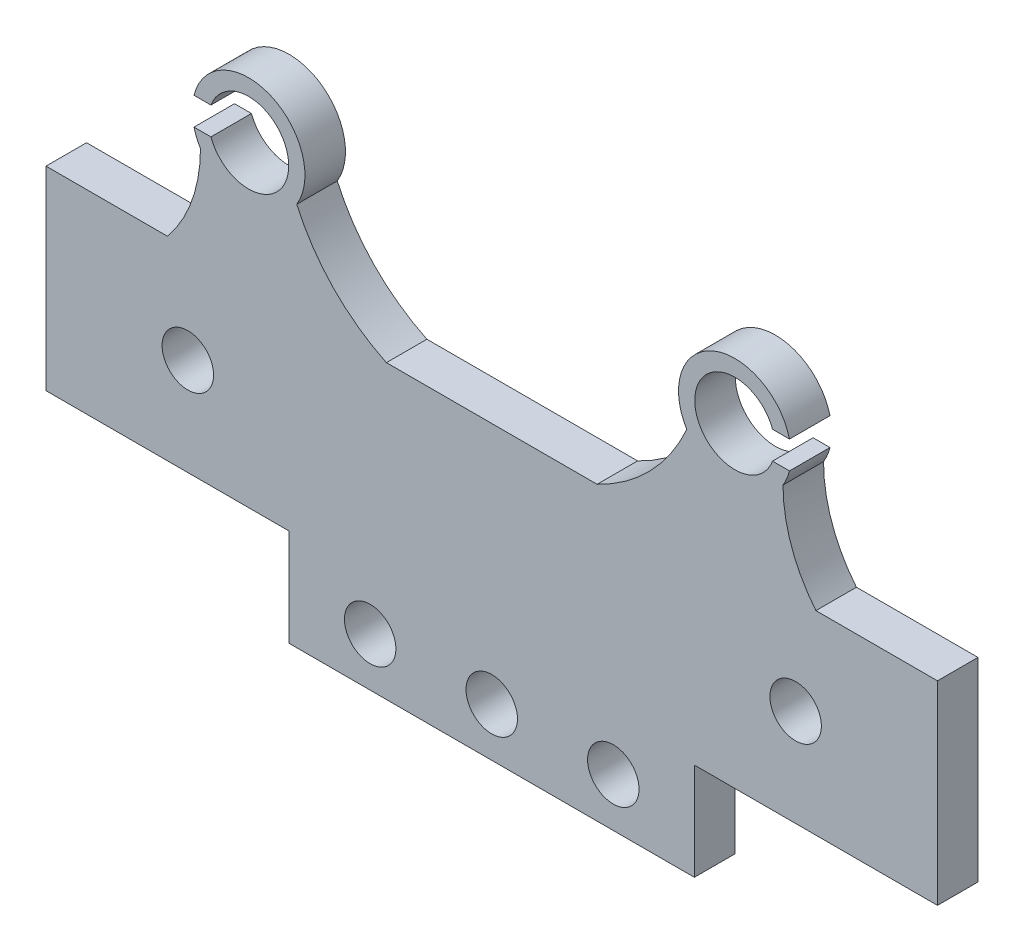
ISO-10303-21;
HEADER;
FILE_DESCRIPTION(('STEP AP214'),'2;1');
FILE_NAME('part.step','',(''),(''),'','','');
FILE_SCHEMA(('AUTOMOTIVE_DESIGN { 1 0 10303 214 1 1 1 1 }'));
ENDSEC;
DATA;
#1=APPLICATION_CONTEXT('core data for automotive mechanical design processes');
#2=APPLICATION_PROTOCOL_DEFINITION('international standard','automotive_design',2000,#1);
#3=PRODUCT_CONTEXT('',#1,'mechanical');
#4=PRODUCT('Part','Part','',(#3));
#5=PRODUCT_RELATED_PRODUCT_CATEGORY('part','',(#4));
#6=PRODUCT_DEFINITION_FORMATION('','',#4);
#7=PRODUCT_DEFINITION_CONTEXT('part definition',#1,'design');
#8=PRODUCT_DEFINITION('design','',#6,#7);
#9=PRODUCT_DEFINITION_SHAPE('','',#8);
#10=(LENGTH_UNIT() NAMED_UNIT(*) SI_UNIT(.MILLI.,.METRE.));
#11=(NAMED_UNIT(*) PLANE_ANGLE_UNIT() SI_UNIT($,.RADIAN.));
#12=(NAMED_UNIT(*) SI_UNIT($,.STERADIAN.) SOLID_ANGLE_UNIT());
#13=UNCERTAINTY_MEASURE_WITH_UNIT(LENGTH_MEASURE(1.E-05),#10,'distance_accuracy_value','');
#14=(GEOMETRIC_REPRESENTATION_CONTEXT(3) GLOBAL_UNCERTAINTY_ASSIGNED_CONTEXT((#13)) GLOBAL_UNIT_ASSIGNED_CONTEXT((#10,
#11,#12)) REPRESENTATION_CONTEXT('',''));
#15=CARTESIAN_POINT('',(0.,0.,0.));
#16=DIRECTION('',(0.,0.,1.));
#17=DIRECTION('',(1.,0.,0.));
#18=AXIS2_PLACEMENT_3D('',#15,#16,#17);
#19=CARTESIAN_POINT('',(53.9385104929325,11.3893777371026,5.));
#20=DIRECTION('',(0.,0.,1.));
#21=DIRECTION('',(1.,0.,0.));
#22=AXIS2_PLACEMENT_3D('',#19,#20,#21);
#23=PLANE('',#22);
#24=CARTESIAN_POINT('',(37.5,-12.,5.));
#25=DIRECTION('',(0.,0.,1.));
#26=DIRECTION('',(-1.,0.,0.));
#27=AXIS2_PLACEMENT_3D('',#24,#25,#26);
#28=CIRCLE('',#27,3.175);
#29=CARTESIAN_POINT('',(34.325,-12.,5.));
#30=VERTEX_POINT('',#29);
#31=EDGE_CURVE('E347',#30,#30,#28,.T.);
#32=ORIENTED_EDGE('',*,*,#31,.F.);
#33=EDGE_LOOP('',(#32));
#34=FACE_BOUND('',#33,.T.);
#35=CARTESIAN_POINT('',(-15.,-30.,5.));
#36=DIRECTION('',(0.,0.,1.));
#37=DIRECTION('',(1.,0.,0.));
#38=AXIS2_PLACEMENT_3D('',#35,#36,#37);
#39=CIRCLE('',#38,3.175);
#40=CARTESIAN_POINT('',(-11.825,-30.,5.));
#41=VERTEX_POINT('',#40);
#42=EDGE_CURVE('E331',#41,#41,#39,.T.);
#43=ORIENTED_EDGE('',*,*,#42,.F.);
#44=EDGE_LOOP('',(#43));
#45=FACE_BOUND('',#44,.T.);
#46=CARTESIAN_POINT('',(-37.5,-12.,5.));
#47=DIRECTION('',(0.,0.,1.));
#48=DIRECTION('',(1.,0.,0.));
#49=AXIS2_PLACEMENT_3D('',#46,#47,#48);
#50=CIRCLE('',#49,3.175);
#51=CARTESIAN_POINT('',(-34.325,-12.,5.));
#52=VERTEX_POINT('',#51);
#53=EDGE_CURVE('E317',#52,#52,#50,.T.);
#54=ORIENTED_EDGE('',*,*,#53,.F.);
#55=EDGE_LOOP('',(#54));
#56=FACE_BOUND('',#55,.T.);
#57=CARTESIAN_POINT('',(0.,-30.,5.));
#58=DIRECTION('',(0.,0.,1.));
#59=DIRECTION('',(1.,0.,0.));
#60=AXIS2_PLACEMENT_3D('',#57,#58,#59);
#61=CIRCLE('',#60,3.175);
#62=CARTESIAN_POINT('',(3.175,-30.,5.));
#63=VERTEX_POINT('',#62);
#64=EDGE_CURVE('E323',#63,#63,#61,.T.);
#65=ORIENTED_EDGE('',*,*,#64,.F.);
#66=EDGE_LOOP('',(#65));
#67=FACE_BOUND('',#66,.T.);
#68=CARTESIAN_POINT('',(15.,-30.,5.));
#69=DIRECTION('',(0.,0.,1.));
#70=DIRECTION('',(-1.,0.,0.));
#71=AXIS2_PLACEMENT_3D('',#68,#69,#70);
#72=CIRCLE('',#71,3.175);
#73=CARTESIAN_POINT('',(11.825,-30.,5.));
#74=VERTEX_POINT('',#73);
#75=EDGE_CURVE('E355',#74,#74,#72,.T.);
#76=ORIENTED_EDGE('',*,*,#75,.F.);
#77=EDGE_LOOP('',(#76));
#78=FACE_BOUND('',#77,.T.);
#79=CARTESIAN_POINT('',(-30.,15.,5.));
#80=DIRECTION('',(0.,0.,1.));
#81=DIRECTION('',(1.,0.,0.));
#82=AXIS2_PLACEMENT_3D('',#79,#80,#81);
#83=CIRCLE('',#82,6.95);
#84=CARTESIAN_POINT('',(-24.0614895070675,11.3893777371027,5.));
#85=VERTEX_POINT('',#84);
#86=CARTESIAN_POINT('',(-36.738879728857,16.7,5.));
#87=VERTEX_POINT('',#86);
#88=EDGE_CURVE('E221',#85,#87,#83,.T.);
#89=ORIENTED_EDGE('',*,*,#88,.T.);
#90=DIRECTION('',(-1.,0.,0.));
#91=VECTOR('',#90,1.);
#92=CARTESIAN_POINT('',(-30.,16.7,5.));
#93=LINE('',#92,#91);
#94=CARTESIAN_POINT('',(-34.6489246068311,16.7,5.));
#95=VERTEX_POINT('',#94);
#96=EDGE_CURVE('E205',#95,#87,#93,.T.);
#97=ORIENTED_EDGE('',*,*,#96,.F.);
#98=CARTESIAN_POINT('',(-30.,15.,5.));
#99=DIRECTION('',(0.,0.,1.));
#100=DIRECTION('',(1.,0.,0.));
#101=AXIS2_PLACEMENT_3D('',#98,#99,#100);
#102=CIRCLE('',#101,4.95);
#103=CARTESIAN_POINT('',(-34.6489246068311,13.3,5.));
#104=VERTEX_POINT('',#103);
#105=EDGE_CURVE('E306',#104,#95,#102,.T.);
#106=ORIENTED_EDGE('',*,*,#105,.F.);
#107=DIRECTION('',(1.,0.,0.));
#108=VECTOR('',#107,1.);
#109=CARTESIAN_POINT('',(-30.,13.3,5.));
#110=LINE('',#109,#108);
#111=CARTESIAN_POINT('',(-36.738879728857,13.3,5.));
#112=VERTEX_POINT('',#111);
#113=EDGE_CURVE('E69',#112,#104,#110,.T.);
#114=ORIENTED_EDGE('',*,*,#113,.F.);
#115=CARTESIAN_POINT('',(-35.9385104929326,11.3893777371026,5.));
#116=VERTEX_POINT('',#115);
#117=EDGE_CURVE('E233',#112,#116,#83,.T.);
#118=ORIENTED_EDGE('',*,*,#117,.T.);
#119=CARTESIAN_POINT('',(-53.9385104929325,11.3893777371026,5.));
#120=DIRECTION('',(0.,0.,-1.));
#121=DIRECTION('',(-1.,0.,0.));
#122=AXIS2_PLACEMENT_3D('',#119,#120,#121);
#123=CIRCLE('',#122,18.);
#124=CARTESIAN_POINT('',(-40.,0.,5.));
#125=VERTEX_POINT('',#124);
#126=EDGE_CURVE('E232',#116,#125,#123,.T.);
#127=ORIENTED_EDGE('',*,*,#126,.T.);
#128=DIRECTION('',(-1.,0.,0.));
#129=VECTOR('',#128,1.);
#130=CARTESIAN_POINT('',(-40.,0.,5.));
#131=LINE('',#130,#129);
#132=CARTESIAN_POINT('',(-55.,0.,5.));
#133=VERTEX_POINT('',#132);
#134=EDGE_CURVE('E255',#125,#133,#131,.T.);
#135=ORIENTED_EDGE('',*,*,#134,.T.);
#136=DIRECTION('',(0.,-1.,0.));
#137=VECTOR('',#136,1.);
#138=CARTESIAN_POINT('',(-55.,0.,5.));
#139=LINE('',#138,#137);
#140=CARTESIAN_POINT('',(-55.,-24.,5.));
#141=VERTEX_POINT('',#140);
#142=EDGE_CURVE('E261',#133,#141,#139,.T.);
#143=ORIENTED_EDGE('',*,*,#142,.T.);
#144=DIRECTION('',(1.,0.,0.));
#145=VECTOR('',#144,1.);
#146=CARTESIAN_POINT('',(-55.,-24.,5.));
#147=LINE('',#146,#145);
#148=CARTESIAN_POINT('',(-25.,-24.,5.));
#149=VERTEX_POINT('',#148);
#150=EDGE_CURVE('E267',#141,#149,#147,.T.);
#151=ORIENTED_EDGE('',*,*,#150,.T.);
#152=DIRECTION('',(0.,-1.,0.));
#153=VECTOR('',#152,1.);
#154=CARTESIAN_POINT('',(-25.,-24.,5.));
#155=LINE('',#154,#153);
#156=CARTESIAN_POINT('',(-25.,-36.,5.));
#157=VERTEX_POINT('',#156);
#158=EDGE_CURVE('E271',#149,#157,#155,.T.);
#159=ORIENTED_EDGE('',*,*,#158,.T.);
#160=DIRECTION('',(1.,0.,0.));
#161=VECTOR('',#160,1.);
#162=CARTESIAN_POINT('',(-25.,-36.,5.));
#163=LINE('',#162,#161);
#164=CARTESIAN_POINT('',(25.,-36.,5.));
#165=VERTEX_POINT('',#164);
#166=EDGE_CURVE('E436',#157,#165,#163,.T.);
#167=ORIENTED_EDGE('',*,*,#166,.T.);
#168=DIRECTION('',(0.,1.,0.));
#169=VECTOR('',#168,1.);
#170=CARTESIAN_POINT('',(25.,-24.,5.));
#171=LINE('',#170,#169);
#172=CARTESIAN_POINT('',(25.,-24.,5.));
#173=VERTEX_POINT('',#172);
#174=EDGE_CURVE('E440',#165,#173,#171,.T.);
#175=ORIENTED_EDGE('',*,*,#174,.T.);
#176=DIRECTION('',(1.,0.,0.));
#177=VECTOR('',#176,1.);
#178=CARTESIAN_POINT('',(55.,-24.,5.));
#179=LINE('',#178,#177);
#180=CARTESIAN_POINT('',(55.,-24.,5.));
#181=VERTEX_POINT('',#180);
#182=EDGE_CURVE('E444',#173,#181,#179,.T.);
#183=ORIENTED_EDGE('',*,*,#182,.T.);
#184=DIRECTION('',(0.,1.,0.));
#185=VECTOR('',#184,1.);
#186=CARTESIAN_POINT('',(55.,0.,5.));
#187=LINE('',#186,#185);
#188=CARTESIAN_POINT('',(55.,0.,5.));
#189=VERTEX_POINT('',#188);
#190=EDGE_CURVE('E450',#181,#189,#187,.T.);
#191=ORIENTED_EDGE('',*,*,#190,.T.);
#192=DIRECTION('',(-1.,0.,0.));
#193=VECTOR('',#192,1.);
#194=CARTESIAN_POINT('',(40.,0.,5.));
#195=LINE('',#194,#193);
#196=CARTESIAN_POINT('',(40.,0.,5.));
#197=VERTEX_POINT('',#196);
#198=EDGE_CURVE('E531',#189,#197,#195,.T.);
#199=ORIENTED_EDGE('',*,*,#198,.T.);
#200=CARTESIAN_POINT('',(53.9385104929325,11.3893777371026,5.));
#201=DIRECTION('',(0.,0.,-1.));
#202=DIRECTION('',(1.,0.,0.));
#203=AXIS2_PLACEMENT_3D('',#200,#201,#202);
#204=CIRCLE('',#203,18.);
#205=CARTESIAN_POINT('',(35.9385104929326,11.3893777371026,5.));
#206=VERTEX_POINT('',#205);
#207=EDGE_CURVE('E525',#197,#206,#204,.T.);
#208=ORIENTED_EDGE('',*,*,#207,.T.);
#209=CARTESIAN_POINT('',(30.,15.,5.));
#210=DIRECTION('',(0.,0.,1.));
#211=DIRECTION('',(-1.,0.,0.));
#212=AXIS2_PLACEMENT_3D('',#209,#210,#211);
#213=CIRCLE('',#212,6.95);
#214=CARTESIAN_POINT('',(36.738879728857,13.3,5.));
#215=VERTEX_POINT('',#214);
#216=EDGE_CURVE('E520',#206,#215,#213,.T.);
#217=ORIENTED_EDGE('',*,*,#216,.T.);
#218=DIRECTION('',(1.,0.,0.));
#219=VECTOR('',#218,1.);
#220=CARTESIAN_POINT('',(30.,13.3,5.));
#221=LINE('',#220,#219);
#222=CARTESIAN_POINT('',(34.6489246068311,13.3,5.));
#223=VERTEX_POINT('',#222);
#224=EDGE_CURVE('E372',#223,#215,#221,.T.);
#225=ORIENTED_EDGE('',*,*,#224,.F.);
#226=CARTESIAN_POINT('',(30.,15.,5.));
#227=DIRECTION('',(0.,0.,1.));
#228=DIRECTION('',(-1.,0.,0.));
#229=AXIS2_PLACEMENT_3D('',#226,#227,#228);
#230=CIRCLE('',#229,4.95);
#231=CARTESIAN_POINT('',(34.6489246068311,16.7,5.));
#232=VERTEX_POINT('',#231);
#233=EDGE_CURVE('E339',#232,#223,#230,.T.);
#234=ORIENTED_EDGE('',*,*,#233,.F.);
#235=DIRECTION('',(-1.,0.,0.));
#236=VECTOR('',#235,1.);
#237=CARTESIAN_POINT('',(30.,16.7,5.));
#238=LINE('',#237,#236);
#239=CARTESIAN_POINT('',(36.738879728857,16.7,5.));
#240=VERTEX_POINT('',#239);
#241=EDGE_CURVE('E377',#240,#232,#238,.T.);
#242=ORIENTED_EDGE('',*,*,#241,.F.);
#243=CARTESIAN_POINT('',(24.0614895070675,11.3893777371026,5.));
#244=VERTEX_POINT('',#243);
#245=EDGE_CURVE('E524',#240,#244,#213,.T.);
#246=ORIENTED_EDGE('',*,*,#245,.T.);
#247=CARTESIAN_POINT('',(3.04543692353487,20.7341909404895,5.));
#248=DIRECTION('',(0.,0.,-1.));
#249=DIRECTION('',(-1.,0.,0.));
#250=AXIS2_PLACEMENT_3D('',#247,#248,#249);
#251=CIRCLE('',#250,23.);
#252=CARTESIAN_POINT('',(13.,0.,5.));
#253=VERTEX_POINT('',#252);
#254=EDGE_CURVE('E516',#244,#253,#251,.T.);
#255=ORIENTED_EDGE('',*,*,#254,.T.);
#256=DIRECTION('',(-1.,0.,0.));
#257=VECTOR('',#256,1.);
#258=CARTESIAN_POINT('',(13.,0.,5.));
#259=LINE('',#258,#257);
#260=CARTESIAN_POINT('',(-13.,0.,5.));
#261=VERTEX_POINT('',#260);
#262=EDGE_CURVE('E513',#253,#261,#259,.T.);
#263=ORIENTED_EDGE('',*,*,#262,.T.);
#264=CARTESIAN_POINT('',(-3.04543692353487,20.7341909404895,5.));
#265=DIRECTION('',(0.,0.,-1.));
#266=DIRECTION('',(1.,0.,0.));
#267=AXIS2_PLACEMENT_3D('',#264,#265,#266);
#268=CIRCLE('',#267,23.);
#269=EDGE_CURVE('E229',#261,#85,#268,.T.);
#270=ORIENTED_EDGE('',*,*,#269,.T.);
#271=EDGE_LOOP('',(#89,#97,#106,#114,#118,#127,#135,#143,#151,#159,#167,#175,#183,#191,#199,
#208,#217,#225,#234,#242,#246,#255,#263,#270));
#272=FACE_BOUND('',#271,.T.);
#273=ADVANCED_FACE('F46',(#34,#45,#56,#67,#78,#272),#23,.T.);
#274=CARTESIAN_POINT('',(53.9385104929325,11.3893777371026,0.));
#275=DIRECTION('',(0.,0.,1.));
#276=DIRECTION('',(1.,0.,0.));
#277=AXIS2_PLACEMENT_3D('',#274,#275,#276);
#278=PLANE('',#277);
#279=CARTESIAN_POINT('',(-37.5,-12.,0.));
#280=DIRECTION('',(0.,0.,1.));
#281=DIRECTION('',(1.,0.,0.));
#282=AXIS2_PLACEMENT_3D('',#279,#280,#281);
#283=CIRCLE('',#282,3.175);
#284=CARTESIAN_POINT('',(-34.325,-12.,0.));
#285=VERTEX_POINT('',#284);
#286=EDGE_CURVE('E319',#285,#285,#283,.T.);
#287=ORIENTED_EDGE('',*,*,#286,.T.);
#288=EDGE_LOOP('',(#287));
#289=FACE_BOUND('',#288,.T.);
#290=CARTESIAN_POINT('',(0.,-30.,0.));
#291=DIRECTION('',(0.,0.,1.));
#292=DIRECTION('',(1.,0.,0.));
#293=AXIS2_PLACEMENT_3D('',#290,#291,#292);
#294=CIRCLE('',#293,3.175);
#295=CARTESIAN_POINT('',(3.175,-30.,0.));
#296=VERTEX_POINT('',#295);
#297=EDGE_CURVE('E327',#296,#296,#294,.T.);
#298=ORIENTED_EDGE('',*,*,#297,.T.);
#299=EDGE_LOOP('',(#298));
#300=FACE_BOUND('',#299,.T.);
#301=CARTESIAN_POINT('',(-15.,-30.,0.));
#302=DIRECTION('',(0.,0.,1.));
#303=DIRECTION('',(1.,0.,0.));
#304=AXIS2_PLACEMENT_3D('',#301,#302,#303);
#305=CIRCLE('',#304,3.175);
#306=CARTESIAN_POINT('',(-11.825,-30.,0.));
#307=VERTEX_POINT('',#306);
#308=EDGE_CURVE('E335',#307,#307,#305,.T.);
#309=ORIENTED_EDGE('',*,*,#308,.T.);
#310=EDGE_LOOP('',(#309));
#311=FACE_BOUND('',#310,.T.);
#312=CARTESIAN_POINT('',(37.5,-12.,0.));
#313=DIRECTION('',(0.,0.,1.));
#314=DIRECTION('',(-1.,0.,0.));
#315=AXIS2_PLACEMENT_3D('',#312,#313,#314);
#316=CIRCLE('',#315,3.175);
#317=CARTESIAN_POINT('',(34.325,-12.,0.));
#318=VERTEX_POINT('',#317);
#319=EDGE_CURVE('E351',#318,#318,#316,.T.);
#320=ORIENTED_EDGE('',*,*,#319,.T.);
#321=EDGE_LOOP('',(#320));
#322=FACE_BOUND('',#321,.T.);
#323=CARTESIAN_POINT('',(15.,-30.,0.));
#324=DIRECTION('',(0.,0.,1.));
#325=DIRECTION('',(-1.,0.,0.));
#326=AXIS2_PLACEMENT_3D('',#323,#324,#325);
#327=CIRCLE('',#326,3.175);
#328=CARTESIAN_POINT('',(11.825,-30.,0.));
#329=VERTEX_POINT('',#328);
#330=EDGE_CURVE('E225',#329,#329,#327,.T.);
#331=ORIENTED_EDGE('',*,*,#330,.T.);
#332=EDGE_LOOP('',(#331));
#333=FACE_BOUND('',#332,.T.);
#334=DIRECTION('',(-1.,0.,0.));
#335=VECTOR('',#334,1.);
#336=CARTESIAN_POINT('',(-30.,16.7,0.));
#337=LINE('',#336,#335);
#338=CARTESIAN_POINT('',(-34.6489246068311,16.7,0.));
#339=VERTEX_POINT('',#338);
#340=CARTESIAN_POINT('',(-36.738879728857,16.7,0.));
#341=VERTEX_POINT('',#340);
#342=EDGE_CURVE('E62',#339,#341,#337,.T.);
#343=ORIENTED_EDGE('',*,*,#342,.T.);
#344=CARTESIAN_POINT('',(-30.,15.,0.));
#345=DIRECTION('',(0.,0.,1.));
#346=DIRECTION('',(1.,0.,0.));
#347=AXIS2_PLACEMENT_3D('',#344,#345,#346);
#348=CIRCLE('',#347,6.95);
#349=CARTESIAN_POINT('',(-24.0614895070675,11.3893777371027,0.));
#350=VERTEX_POINT('',#349);
#351=EDGE_CURVE('E223',#350,#341,#348,.T.);
#352=ORIENTED_EDGE('',*,*,#351,.F.);
#353=CARTESIAN_POINT('',(-3.04543692353487,20.7341909404895,0.));
#354=DIRECTION('',(0.,0.,-1.));
#355=DIRECTION('',(1.,0.,0.));
#356=AXIS2_PLACEMENT_3D('',#353,#354,#355);
#357=CIRCLE('',#356,23.);
#358=CARTESIAN_POINT('',(-13.,0.,0.));
#359=VERTEX_POINT('',#358);
#360=EDGE_CURVE('E687',#359,#350,#357,.T.);
#361=ORIENTED_EDGE('',*,*,#360,.F.);
#362=DIRECTION('',(-1.,0.,0.));
#363=VECTOR('',#362,1.);
#364=CARTESIAN_POINT('',(13.,0.,0.));
#365=LINE('',#364,#363);
#366=CARTESIAN_POINT('',(13.,0.,0.));
#367=VERTEX_POINT('',#366);
#368=EDGE_CURVE('E507',#367,#359,#365,.T.);
#369=ORIENTED_EDGE('',*,*,#368,.F.);
#370=CARTESIAN_POINT('',(3.04543692353487,20.7341909404895,0.));
#371=DIRECTION('',(0.,0.,-1.));
#372=DIRECTION('',(-1.,0.,0.));
#373=AXIS2_PLACEMENT_3D('',#370,#371,#372);
#374=CIRCLE('',#373,23.);
#375=CARTESIAN_POINT('',(24.0614895070675,11.3893777371026,0.));
#376=VERTEX_POINT('',#375);
#377=EDGE_CURVE('E502',#376,#367,#374,.T.);
#378=ORIENTED_EDGE('',*,*,#377,.F.);
#379=CARTESIAN_POINT('',(30.,15.,0.));
#380=DIRECTION('',(0.,0.,1.));
#381=DIRECTION('',(-1.,0.,0.));
#382=AXIS2_PLACEMENT_3D('',#379,#380,#381);
#383=CIRCLE('',#382,6.95);
#384=CARTESIAN_POINT('',(36.738879728857,16.7,0.));
#385=VERTEX_POINT('',#384);
#386=EDGE_CURVE('E503',#385,#376,#383,.T.);
#387=ORIENTED_EDGE('',*,*,#386,.F.);
#388=DIRECTION('',(-1.,0.,0.));
#389=VECTOR('',#388,1.);
#390=CARTESIAN_POINT('',(30.,16.7,0.));
#391=LINE('',#390,#389);
#392=CARTESIAN_POINT('',(34.6489246068311,16.7,0.));
#393=VERTEX_POINT('',#392);
#394=EDGE_CURVE('E378',#385,#393,#391,.T.);
#395=ORIENTED_EDGE('',*,*,#394,.T.);
#396=CARTESIAN_POINT('',(30.,15.,0.));
#397=DIRECTION('',(0.,0.,1.));
#398=DIRECTION('',(-1.,0.,0.));
#399=AXIS2_PLACEMENT_3D('',#396,#397,#398);
#400=CIRCLE('',#399,4.95);
#401=CARTESIAN_POINT('',(34.6489246068311,13.3,0.));
#402=VERTEX_POINT('',#401);
#403=EDGE_CURVE('E343',#393,#402,#400,.T.);
#404=ORIENTED_EDGE('',*,*,#403,.T.);
#405=DIRECTION('',(1.,0.,0.));
#406=VECTOR('',#405,1.);
#407=CARTESIAN_POINT('',(30.,13.3,0.));
#408=LINE('',#407,#406);
#409=CARTESIAN_POINT('',(36.738879728857,13.3,0.));
#410=VERTEX_POINT('',#409);
#411=EDGE_CURVE('E373',#402,#410,#408,.T.);
#412=ORIENTED_EDGE('',*,*,#411,.T.);
#413=CARTESIAN_POINT('',(35.9385104929326,11.3893777371026,0.));
#414=VERTEX_POINT('',#413);
#415=EDGE_CURVE('E497',#414,#410,#383,.T.);
#416=ORIENTED_EDGE('',*,*,#415,.F.);
#417=CARTESIAN_POINT('',(53.9385104929325,11.3893777371026,0.));
#418=DIRECTION('',(0.,0.,-1.));
#419=DIRECTION('',(1.,0.,0.));
#420=AXIS2_PLACEMENT_3D('',#417,#418,#419);
#421=CIRCLE('',#420,18.);
#422=CARTESIAN_POINT('',(40.,0.,0.));
#423=VERTEX_POINT('',#422);
#424=EDGE_CURVE('E487',#423,#414,#421,.T.);
#425=ORIENTED_EDGE('',*,*,#424,.F.);
#426=DIRECTION('',(-1.,0.,0.));
#427=VECTOR('',#426,1.);
#428=CARTESIAN_POINT('',(40.,0.,0.));
#429=LINE('',#428,#427);
#430=CARTESIAN_POINT('',(55.,0.,0.));
#431=VERTEX_POINT('',#430);
#432=EDGE_CURVE('E483',#431,#423,#429,.T.);
#433=ORIENTED_EDGE('',*,*,#432,.F.);
#434=DIRECTION('',(0.,1.,0.));
#435=VECTOR('',#434,1.);
#436=CARTESIAN_POINT('',(55.,0.,0.));
#437=LINE('',#436,#435);
#438=CARTESIAN_POINT('',(55.,-24.,0.));
#439=VERTEX_POINT('',#438);
#440=EDGE_CURVE('E477',#439,#431,#437,.T.);
#441=ORIENTED_EDGE('',*,*,#440,.F.);
#442=DIRECTION('',(1.,0.,0.));
#443=VECTOR('',#442,1.);
#444=CARTESIAN_POINT('',(55.,-24.,0.));
#445=LINE('',#444,#443);
#446=CARTESIAN_POINT('',(25.,-24.,0.));
#447=VERTEX_POINT('',#446);
#448=EDGE_CURVE('E473',#447,#439,#445,.T.);
#449=ORIENTED_EDGE('',*,*,#448,.F.);
#450=DIRECTION('',(0.,1.,0.));
#451=VECTOR('',#450,1.);
#452=CARTESIAN_POINT('',(25.,-24.,0.));
#453=LINE('',#452,#451);
#454=CARTESIAN_POINT('',(25.,-36.,0.));
#455=VERTEX_POINT('',#454);
#456=EDGE_CURVE('E478',#455,#447,#453,.T.);
#457=ORIENTED_EDGE('',*,*,#456,.F.);
#458=DIRECTION('',(1.,0.,0.));
#459=VECTOR('',#458,1.);
#460=CARTESIAN_POINT('',(-25.,-36.,0.));
#461=LINE('',#460,#459);
#462=CARTESIAN_POINT('',(-25.,-36.,0.));
#463=VERTEX_POINT('',#462);
#464=EDGE_CURVE('E996',#463,#455,#461,.T.);
#465=ORIENTED_EDGE('',*,*,#464,.F.);
#466=DIRECTION('',(0.,-1.,0.));
#467=VECTOR('',#466,1.);
#468=CARTESIAN_POINT('',(-25.,-24.,0.));
#469=LINE('',#468,#467);
#470=CARTESIAN_POINT('',(-25.,-24.,0.));
#471=VERTEX_POINT('',#470);
#472=EDGE_CURVE('E999',#471,#463,#469,.T.);
#473=ORIENTED_EDGE('',*,*,#472,.F.);
#474=DIRECTION('',(1.,0.,0.));
#475=VECTOR('',#474,1.);
#476=CARTESIAN_POINT('',(-55.,-24.,0.));
#477=LINE('',#476,#475);
#478=CARTESIAN_POINT('',(-55.,-24.,0.));
#479=VERTEX_POINT('',#478);
#480=EDGE_CURVE('E427',#479,#471,#477,.T.);
#481=ORIENTED_EDGE('',*,*,#480,.F.);
#482=DIRECTION('',(0.,-1.,0.));
#483=VECTOR('',#482,1.);
#484=CARTESIAN_POINT('',(-55.,0.,0.));
#485=LINE('',#484,#483);
#486=CARTESIAN_POINT('',(-55.,0.,0.));
#487=VERTEX_POINT('',#486);
#488=EDGE_CURVE('E316',#487,#479,#485,.T.);
#489=ORIENTED_EDGE('',*,*,#488,.F.);
#490=DIRECTION('',(-1.,0.,0.));
#491=VECTOR('',#490,1.);
#492=CARTESIAN_POINT('',(-40.,0.,0.));
#493=LINE('',#492,#491);
#494=CARTESIAN_POINT('',(-40.,0.,0.));
#495=VERTEX_POINT('',#494);
#496=EDGE_CURVE('E311',#495,#487,#493,.T.);
#497=ORIENTED_EDGE('',*,*,#496,.F.);
#498=CARTESIAN_POINT('',(-53.9385104929325,11.3893777371026,0.));
#499=DIRECTION('',(0.,0.,-1.));
#500=DIRECTION('',(-1.,0.,0.));
#501=AXIS2_PLACEMENT_3D('',#498,#499,#500);
#502=CIRCLE('',#501,18.);
#503=CARTESIAN_POINT('',(-35.9385104929326,11.3893777371026,0.));
#504=VERTEX_POINT('',#503);
#505=EDGE_CURVE('E262',#504,#495,#502,.T.);
#506=ORIENTED_EDGE('',*,*,#505,.F.);
#507=CARTESIAN_POINT('',(-36.738879728857,13.3,0.));
#508=VERTEX_POINT('',#507);
#509=EDGE_CURVE('E399',#508,#504,#348,.T.);
#510=ORIENTED_EDGE('',*,*,#509,.F.);
#511=DIRECTION('',(1.,0.,0.));
#512=VECTOR('',#511,1.);
#513=CARTESIAN_POINT('',(-30.,13.3,0.));
#514=LINE('',#513,#512);
#515=CARTESIAN_POINT('',(-34.6489246068311,13.3,0.));
#516=VERTEX_POINT('',#515);
#517=EDGE_CURVE('E214',#508,#516,#514,.T.);
#518=ORIENTED_EDGE('',*,*,#517,.T.);
#519=CARTESIAN_POINT('',(-30.,15.,0.));
#520=DIRECTION('',(0.,0.,1.));
#521=DIRECTION('',(1.,0.,0.));
#522=AXIS2_PLACEMENT_3D('',#519,#520,#521);
#523=CIRCLE('',#522,4.95);
#524=EDGE_CURVE('E263',#516,#339,#523,.T.);
#525=ORIENTED_EDGE('',*,*,#524,.T.);
#526=EDGE_LOOP('',(#343,#352,#361,#369,#378,#387,#395,#404,#412,#416,#425,#433,#441,#449,#457,
#465,#473,#481,#489,#497,#506,#510,#518,#525));
#527=FACE_BOUND('',#526,.T.);
#528=ADVANCED_FACE('F395',(#289,#300,#311,#322,#333,#527),#278,.F.);
#529=CARTESIAN_POINT('',(30.,15.,5.));
#530=DIRECTION('',(0.,0.,-1.));
#531=DIRECTION('',(-1.,0.,0.));
#532=AXIS2_PLACEMENT_3D('',#529,#530,#531);
#533=CYLINDRICAL_SURFACE('',#532,6.95);
#534=DIRECTION('',(0.,0.,-1.));
#535=VECTOR('',#534,1.);
#536=CARTESIAN_POINT('',(36.738879728857,16.7,5.));
#537=LINE('',#536,#535);
#538=EDGE_CURVE('E368',#240,#385,#537,.T.);
#539=ORIENTED_EDGE('',*,*,#538,.T.);
#540=ORIENTED_EDGE('',*,*,#386,.T.);
#541=DIRECTION('',(0.,0.,-1.));
#542=VECTOR('',#541,1.);
#543=CARTESIAN_POINT('',(24.0614895070675,11.3893777371026,5.));
#544=LINE('',#543,#542);
#545=EDGE_CURVE('E584',#244,#376,#544,.T.);
#546=ORIENTED_EDGE('',*,*,#545,.F.);
#547=ORIENTED_EDGE('',*,*,#245,.F.);
#548=EDGE_LOOP('',(#539,#540,#546,#547));
#549=FACE_BOUND('',#548,.T.);
#550=ADVANCED_FACE('F582',(#549),#533,.T.);
#551=DIRECTION('',(0.,0.,-1.));
#552=VECTOR('',#551,1.);
#553=CARTESIAN_POINT('',(36.738879728857,13.3,5.));
#554=LINE('',#553,#552);
#555=EDGE_CURVE('E365',#215,#410,#554,.T.);
#556=ORIENTED_EDGE('',*,*,#555,.F.);
#557=ORIENTED_EDGE('',*,*,#216,.F.);
#558=DIRECTION('',(0.,0.,-1.));
#559=VECTOR('',#558,1.);
#560=CARTESIAN_POINT('',(35.9385104929326,11.3893777371026,5.));
#561=LINE('',#560,#559);
#562=EDGE_CURVE('E559',#206,#414,#561,.T.);
#563=ORIENTED_EDGE('',*,*,#562,.T.);
#564=ORIENTED_EDGE('',*,*,#415,.T.);
#565=EDGE_LOOP('',(#556,#557,#563,#564));
#566=FACE_BOUND('',#565,.T.);
#567=ADVANCED_FACE('F569',(#566),#533,.T.);
#568=CARTESIAN_POINT('',(-30.,15.,5.));
#569=DIRECTION('',(0.,0.,-1.));
#570=DIRECTION('',(-1.,0.,0.));
#571=AXIS2_PLACEMENT_3D('',#568,#569,#570);
#572=CYLINDRICAL_SURFACE('',#571,6.95);
#573=DIRECTION('',(0.,0.,-1.));
#574=VECTOR('',#573,1.);
#575=CARTESIAN_POINT('',(-36.738879728857,16.7,5.));
#576=LINE('',#575,#574);
#577=EDGE_CURVE('E208',#87,#341,#576,.T.);
#578=ORIENTED_EDGE('',*,*,#577,.F.);
#579=ORIENTED_EDGE('',*,*,#88,.F.);
#580=DIRECTION('',(0.,0.,-1.));
#581=VECTOR('',#580,1.);
#582=CARTESIAN_POINT('',(-24.0614895070675,11.3893777371027,5.));
#583=LINE('',#582,#581);
#584=EDGE_CURVE('E603',#85,#350,#583,.T.);
#585=ORIENTED_EDGE('',*,*,#584,.T.);
#586=ORIENTED_EDGE('',*,*,#351,.T.);
#587=EDGE_LOOP('',(#578,#579,#585,#586));
#588=FACE_BOUND('',#587,.T.);
#589=ADVANCED_FACE('F219',(#588),#572,.T.);
#590=DIRECTION('',(0.,0.,-1.));
#591=VECTOR('',#590,1.);
#592=CARTESIAN_POINT('',(-36.738879728857,13.3,5.));
#593=LINE('',#592,#591);
#594=EDGE_CURVE('E226',#112,#508,#593,.T.);
#595=ORIENTED_EDGE('',*,*,#594,.T.);
#596=ORIENTED_EDGE('',*,*,#509,.T.);
#597=DIRECTION('',(0.,0.,-1.));
#598=VECTOR('',#597,1.);
#599=CARTESIAN_POINT('',(-35.9385104929326,11.3893777371026,5.));
#600=LINE('',#599,#598);
#601=EDGE_CURVE('E405',#116,#504,#600,.T.);
#602=ORIENTED_EDGE('',*,*,#601,.F.);
#603=ORIENTED_EDGE('',*,*,#117,.F.);
#604=EDGE_LOOP('',(#595,#596,#602,#603));
#605=FACE_BOUND('',#604,.T.);
#606=ADVANCED_FACE('F402',(#605),#572,.T.);
#607=CARTESIAN_POINT('',(-30.,15.,5.));
#608=DIRECTION('',(0.,0.,-1.));
#609=DIRECTION('',(-1.,0.,0.));
#610=AXIS2_PLACEMENT_3D('',#607,#608,#609);
#611=CYLINDRICAL_SURFACE('',#610,4.95);
#612=ORIENTED_EDGE('',*,*,#105,.T.);
#613=DIRECTION('',(0.,0.,-1.));
#614=VECTOR('',#613,1.);
#615=CARTESIAN_POINT('',(-34.6489246068311,16.7,5.));
#616=LINE('',#615,#614);
#617=EDGE_CURVE('E12',#95,#339,#616,.T.);
#618=ORIENTED_EDGE('',*,*,#617,.T.);
#619=ORIENTED_EDGE('',*,*,#524,.F.);
#620=DIRECTION('',(0.,0.,-1.));
#621=VECTOR('',#620,1.);
#622=CARTESIAN_POINT('',(-34.6489246068311,13.3,5.));
#623=LINE('',#622,#621);
#624=EDGE_CURVE('E55',#516,#104,#623,.F.);
#625=ORIENTED_EDGE('',*,*,#624,.T.);
#626=EDGE_LOOP('',(#612,#618,#619,#625));
#627=FACE_BOUND('',#626,.T.);
#628=ADVANCED_FACE('F305',(#627),#611,.F.);
#629=CARTESIAN_POINT('',(30.,15.,5.));
#630=DIRECTION('',(0.,0.,-1.));
#631=DIRECTION('',(-1.,0.,0.));
#632=AXIS2_PLACEMENT_3D('',#629,#630,#631);
#633=CYLINDRICAL_SURFACE('',#632,4.95);
#634=ORIENTED_EDGE('',*,*,#403,.F.);
#635=DIRECTION('',(0.,0.,-1.));
#636=VECTOR('',#635,1.);
#637=CARTESIAN_POINT('',(34.6489246068311,16.7,5.));
#638=LINE('',#637,#636);
#639=EDGE_CURVE('E299',#393,#232,#638,.F.);
#640=ORIENTED_EDGE('',*,*,#639,.T.);
#641=ORIENTED_EDGE('',*,*,#233,.T.);
#642=DIRECTION('',(0.,0.,-1.));
#643=VECTOR('',#642,1.);
#644=CARTESIAN_POINT('',(34.6489246068311,13.3,5.));
#645=LINE('',#644,#643);
#646=EDGE_CURVE('E295',#223,#402,#645,.T.);
#647=ORIENTED_EDGE('',*,*,#646,.T.);
#648=EDGE_LOOP('',(#634,#640,#641,#647));
#649=FACE_BOUND('',#648,.T.);
#650=ADVANCED_FACE('F576',(#649),#633,.F.);
#651=CARTESIAN_POINT('',(-40.,0.,5.));
#652=DIRECTION('',(0.,-1.,0.));
#653=DIRECTION('',(1.,0.,0.));
#654=AXIS2_PLACEMENT_3D('',#651,#652,#653);
#655=PLANE('',#654);
#656=ORIENTED_EDGE('',*,*,#496,.T.);
#657=DIRECTION('',(0.,0.,-1.));
#658=VECTOR('',#657,1.);
#659=CARTESIAN_POINT('',(-55.,0.,5.));
#660=LINE('',#659,#658);
#661=EDGE_CURVE('E288',#133,#487,#660,.T.);
#662=ORIENTED_EDGE('',*,*,#661,.F.);
#663=ORIENTED_EDGE('',*,*,#134,.F.);
#664=DIRECTION('',(0.,0.,-1.));
#665=VECTOR('',#664,1.);
#666=CARTESIAN_POINT('',(-40.,0.,5.));
#667=LINE('',#666,#665);
#668=EDGE_CURVE('E238',#125,#495,#667,.T.);
#669=ORIENTED_EDGE('',*,*,#668,.T.);
#670=EDGE_LOOP('',(#656,#662,#663,#669));
#671=FACE_BOUND('',#670,.T.);
#672=ADVANCED_FACE('F48',(#671),#655,.F.);
#673=CARTESIAN_POINT('',(-55.,0.,5.));
#674=DIRECTION('',(1.,0.,0.));
#675=DIRECTION('',(0.,0.,-1.));
#676=AXIS2_PLACEMENT_3D('',#673,#674,#675);
#677=PLANE('',#676);
#678=ORIENTED_EDGE('',*,*,#488,.T.);
#679=DIRECTION('',(0.,0.,-1.));
#680=VECTOR('',#679,1.);
#681=CARTESIAN_POINT('',(-55.,-24.,5.));
#682=LINE('',#681,#680);
#683=EDGE_CURVE('E283',#141,#479,#682,.T.);
#684=ORIENTED_EDGE('',*,*,#683,.F.);
#685=ORIENTED_EDGE('',*,*,#142,.F.);
#686=ORIENTED_EDGE('',*,*,#661,.T.);
#687=EDGE_LOOP('',(#678,#684,#685,#686));
#688=FACE_BOUND('',#687,.T.);
#689=ADVANCED_FACE('F417',(#688),#677,.F.);
#690=CARTESIAN_POINT('',(-55.,-24.,5.));
#691=DIRECTION('',(0.,1.,0.));
#692=DIRECTION('',(0.,0.,1.));
#693=AXIS2_PLACEMENT_3D('',#690,#691,#692);
#694=PLANE('',#693);
#695=ORIENTED_EDGE('',*,*,#480,.T.);
#696=DIRECTION('',(0.,0.,-1.));
#697=VECTOR('',#696,1.);
#698=CARTESIAN_POINT('',(-25.,-24.,5.));
#699=LINE('',#698,#697);
#700=EDGE_CURVE('E289',#149,#471,#699,.T.);
#701=ORIENTED_EDGE('',*,*,#700,.F.);
#702=ORIENTED_EDGE('',*,*,#150,.F.);
#703=ORIENTED_EDGE('',*,*,#683,.T.);
#704=EDGE_LOOP('',(#695,#701,#702,#703));
#705=FACE_BOUND('',#704,.T.);
#706=ADVANCED_FACE('F425',(#705),#694,.F.);
#707=CARTESIAN_POINT('',(-25.,-24.,5.));
#708=DIRECTION('',(1.,0.,0.));
#709=DIRECTION('',(0.,0.,-1.));
#710=AXIS2_PLACEMENT_3D('',#707,#708,#709);
#711=PLANE('',#710);
#712=ORIENTED_EDGE('',*,*,#472,.T.);
#713=DIRECTION('',(0.,0.,-1.));
#714=VECTOR('',#713,1.);
#715=CARTESIAN_POINT('',(-25.,-36.,5.));
#716=LINE('',#715,#714);
#717=EDGE_CURVE('E431',#157,#463,#716,.T.);
#718=ORIENTED_EDGE('',*,*,#717,.F.);
#719=ORIENTED_EDGE('',*,*,#158,.F.);
#720=ORIENTED_EDGE('',*,*,#700,.T.);
#721=EDGE_LOOP('',(#712,#718,#719,#720));
#722=FACE_BOUND('',#721,.T.);
#723=ADVANCED_FACE('F432',(#722),#711,.F.);
#724=CARTESIAN_POINT('',(-25.,-36.,5.));
#725=DIRECTION('',(0.,1.,0.));
#726=DIRECTION('',(0.,0.,1.));
#727=AXIS2_PLACEMENT_3D('',#724,#725,#726);
#728=PLANE('',#727);
#729=ORIENTED_EDGE('',*,*,#464,.T.);
#730=DIRECTION('',(0.,0.,-1.));
#731=VECTOR('',#730,1.);
#732=CARTESIAN_POINT('',(25.,-36.,5.));
#733=LINE('',#732,#731);
#734=EDGE_CURVE('E464',#165,#455,#733,.T.);
#735=ORIENTED_EDGE('',*,*,#734,.F.);
#736=ORIENTED_EDGE('',*,*,#166,.F.);
#737=ORIENTED_EDGE('',*,*,#717,.T.);
#738=EDGE_LOOP('',(#729,#735,#736,#737));
#739=FACE_BOUND('',#738,.T.);
#740=ADVANCED_FACE('F625',(#739),#728,.F.);
#741=CARTESIAN_POINT('',(25.,-24.,5.));
#742=DIRECTION('',(-1.,0.,0.));
#743=DIRECTION('',(0.,0.,1.));
#744=AXIS2_PLACEMENT_3D('',#741,#742,#743);
#745=PLANE('',#744);
#746=ORIENTED_EDGE('',*,*,#456,.T.);
#747=DIRECTION('',(0.,0.,-1.));
#748=VECTOR('',#747,1.);
#749=CARTESIAN_POINT('',(25.,-24.,5.));
#750=LINE('',#749,#748);
#751=EDGE_CURVE('E459',#173,#447,#750,.T.);
#752=ORIENTED_EDGE('',*,*,#751,.F.);
#753=ORIENTED_EDGE('',*,*,#174,.F.);
#754=ORIENTED_EDGE('',*,*,#734,.T.);
#755=EDGE_LOOP('',(#746,#752,#753,#754));
#756=FACE_BOUND('',#755,.T.);
#757=ADVANCED_FACE('F644',(#756),#745,.F.);
#758=CARTESIAN_POINT('',(55.,-24.,5.));
#759=DIRECTION('',(0.,1.,0.));
#760=DIRECTION('',(0.,0.,1.));
#761=AXIS2_PLACEMENT_3D('',#758,#759,#760);
#762=PLANE('',#761);
#763=ORIENTED_EDGE('',*,*,#448,.T.);
#764=DIRECTION('',(0.,0.,-1.));
#765=VECTOR('',#764,1.);
#766=CARTESIAN_POINT('',(55.,-24.,5.));
#767=LINE('',#766,#765);
#768=EDGE_CURVE('E465',#181,#439,#767,.T.);
#769=ORIENTED_EDGE('',*,*,#768,.F.);
#770=ORIENTED_EDGE('',*,*,#182,.F.);
#771=ORIENTED_EDGE('',*,*,#751,.T.);
#772=EDGE_LOOP('',(#763,#769,#770,#771));
#773=FACE_BOUND('',#772,.T.);
#774=ADVANCED_FACE('F661',(#773),#762,.F.);
#775=CARTESIAN_POINT('',(55.,0.,5.));
#776=DIRECTION('',(-1.,0.,0.));
#777=DIRECTION('',(0.,0.,1.));
#778=AXIS2_PLACEMENT_3D('',#775,#776,#777);
#779=PLANE('',#778);
#780=ORIENTED_EDGE('',*,*,#440,.T.);
#781=DIRECTION('',(0.,0.,-1.));
#782=VECTOR('',#781,1.);
#783=CARTESIAN_POINT('',(55.,0.,5.));
#784=LINE('',#783,#782);
#785=EDGE_CURVE('E546',#189,#431,#784,.T.);
#786=ORIENTED_EDGE('',*,*,#785,.F.);
#787=ORIENTED_EDGE('',*,*,#190,.F.);
#788=ORIENTED_EDGE('',*,*,#768,.T.);
#789=EDGE_LOOP('',(#780,#786,#787,#788));
#790=FACE_BOUND('',#789,.T.);
#791=ADVANCED_FACE('F547',(#790),#779,.F.);
#792=CARTESIAN_POINT('',(40.,0.,5.));
#793=DIRECTION('',(0.,-1.,0.));
#794=DIRECTION('',(1.,0.,0.));
#795=AXIS2_PLACEMENT_3D('',#792,#793,#794);
#796=PLANE('',#795);
#797=ORIENTED_EDGE('',*,*,#432,.T.);
#798=DIRECTION('',(0.,0.,-1.));
#799=VECTOR('',#798,1.);
#800=CARTESIAN_POINT('',(40.,0.,5.));
#801=LINE('',#800,#799);
#802=EDGE_CURVE('E552',#197,#423,#801,.T.);
#803=ORIENTED_EDGE('',*,*,#802,.F.);
#804=ORIENTED_EDGE('',*,*,#198,.F.);
#805=ORIENTED_EDGE('',*,*,#785,.T.);
#806=EDGE_LOOP('',(#797,#803,#804,#805));
#807=FACE_BOUND('',#806,.T.);
#808=ADVANCED_FACE('F553',(#807),#796,.F.);
#809=CARTESIAN_POINT('',(53.9385104929325,11.3893777371026,5.));
#810=DIRECTION('',(0.,0.,-1.));
#811=DIRECTION('',(-1.,0.,0.));
#812=AXIS2_PLACEMENT_3D('',#809,#810,#811);
#813=CYLINDRICAL_SURFACE('',#812,18.);
#814=ORIENTED_EDGE('',*,*,#424,.T.);
#815=ORIENTED_EDGE('',*,*,#562,.F.);
#816=ORIENTED_EDGE('',*,*,#207,.F.);
#817=ORIENTED_EDGE('',*,*,#802,.T.);
#818=EDGE_LOOP('',(#814,#815,#816,#817));
#819=FACE_BOUND('',#818,.T.);
#820=ADVANCED_FACE('F562',(#819),#813,.F.);
#821=CARTESIAN_POINT('',(3.04543692353487,20.7341909404895,5.));
#822=DIRECTION('',(0.,0.,-1.));
#823=DIRECTION('',(-1.,0.,0.));
#824=AXIS2_PLACEMENT_3D('',#821,#822,#823);
#825=CYLINDRICAL_SURFACE('',#824,23.);
#826=ORIENTED_EDGE('',*,*,#377,.T.);
#827=DIRECTION('',(0.,0.,-1.));
#828=VECTOR('',#827,1.);
#829=CARTESIAN_POINT('',(13.,0.,5.));
#830=LINE('',#829,#828);
#831=EDGE_CURVE('E589',#253,#367,#830,.T.);
#832=ORIENTED_EDGE('',*,*,#831,.F.);
#833=ORIENTED_EDGE('',*,*,#254,.F.);
#834=ORIENTED_EDGE('',*,*,#545,.T.);
#835=EDGE_LOOP('',(#826,#832,#833,#834));
#836=FACE_BOUND('',#835,.T.);
#837=ADVANCED_FACE('F592',(#836),#825,.F.);
#838=CARTESIAN_POINT('',(13.,0.,5.));
#839=DIRECTION('',(0.,-1.,0.));
#840=DIRECTION('',(0.,0.,-1.));
#841=AXIS2_PLACEMENT_3D('',#838,#839,#840);
#842=PLANE('',#841);
#843=ORIENTED_EDGE('',*,*,#368,.T.);
#844=DIRECTION('',(0.,0.,-1.));
#845=VECTOR('',#844,1.);
#846=CARTESIAN_POINT('',(-13.,0.,5.));
#847=LINE('',#846,#845);
#848=EDGE_CURVE('E598',#261,#359,#847,.T.);
#849=ORIENTED_EDGE('',*,*,#848,.F.);
#850=ORIENTED_EDGE('',*,*,#262,.F.);
#851=ORIENTED_EDGE('',*,*,#831,.T.);
#852=EDGE_LOOP('',(#843,#849,#850,#851));
#853=FACE_BOUND('',#852,.T.);
#854=ADVANCED_FACE('F599',(#853),#842,.F.);
#855=CARTESIAN_POINT('',(-3.04543692353487,20.7341909404895,5.));
#856=DIRECTION('',(0.,0.,-1.));
#857=DIRECTION('',(-1.,0.,0.));
#858=AXIS2_PLACEMENT_3D('',#855,#856,#857);
#859=CYLINDRICAL_SURFACE('',#858,23.);
#860=ORIENTED_EDGE('',*,*,#360,.T.);
#861=ORIENTED_EDGE('',*,*,#584,.F.);
#862=ORIENTED_EDGE('',*,*,#269,.F.);
#863=ORIENTED_EDGE('',*,*,#848,.T.);
#864=EDGE_LOOP('',(#860,#861,#862,#863));
#865=FACE_BOUND('',#864,.T.);
#866=ADVANCED_FACE('F605',(#865),#859,.F.);
#867=CARTESIAN_POINT('',(-53.9385104929325,11.3893777371026,5.));
#868=DIRECTION('',(0.,0.,-1.));
#869=DIRECTION('',(-1.,0.,0.));
#870=AXIS2_PLACEMENT_3D('',#867,#868,#869);
#871=CYLINDRICAL_SURFACE('',#870,18.);
#872=ORIENTED_EDGE('',*,*,#505,.T.);
#873=ORIENTED_EDGE('',*,*,#668,.F.);
#874=ORIENTED_EDGE('',*,*,#126,.F.);
#875=ORIENTED_EDGE('',*,*,#601,.T.);
#876=EDGE_LOOP('',(#872,#873,#874,#875));
#877=FACE_BOUND('',#876,.T.);
#878=ADVANCED_FACE('F412',(#877),#871,.F.);
#879=CARTESIAN_POINT('',(-37.5,-12.,5.));
#880=DIRECTION('',(0.,0.,-1.));
#881=DIRECTION('',(-1.,0.,0.));
#882=AXIS2_PLACEMENT_3D('',#879,#880,#881);
#883=CYLINDRICAL_SURFACE('',#882,3.175);
#884=ORIENTED_EDGE('',*,*,#53,.T.);
#885=EDGE_LOOP('',(#884));
#886=FACE_BOUND('',#885,.T.);
#887=ORIENTED_EDGE('',*,*,#286,.F.);
#888=EDGE_LOOP('',(#887));
#889=FACE_BOUND('',#888,.T.);
#890=ADVANCED_FACE('F868',(#886,#889),#883,.F.);
#891=CARTESIAN_POINT('',(0.,-30.,5.));
#892=DIRECTION('',(0.,0.,-1.));
#893=DIRECTION('',(-1.,0.,0.));
#894=AXIS2_PLACEMENT_3D('',#891,#892,#893);
#895=CYLINDRICAL_SURFACE('',#894,3.175);
#896=ORIENTED_EDGE('',*,*,#64,.T.);
#897=EDGE_LOOP('',(#896));
#898=FACE_BOUND('',#897,.T.);
#899=ORIENTED_EDGE('',*,*,#297,.F.);
#900=EDGE_LOOP('',(#899));
#901=FACE_BOUND('',#900,.T.);
#902=ADVANCED_FACE('F722',(#898,#901),#895,.F.);
#903=CARTESIAN_POINT('',(-15.,-30.,5.));
#904=DIRECTION('',(0.,0.,-1.));
#905=DIRECTION('',(-1.,0.,0.));
#906=AXIS2_PLACEMENT_3D('',#903,#904,#905);
#907=CYLINDRICAL_SURFACE('',#906,3.175);
#908=ORIENTED_EDGE('',*,*,#42,.T.);
#909=EDGE_LOOP('',(#908));
#910=FACE_BOUND('',#909,.T.);
#911=ORIENTED_EDGE('',*,*,#308,.F.);
#912=EDGE_LOOP('',(#911));
#913=FACE_BOUND('',#912,.T.);
#914=ADVANCED_FACE('F716',(#910,#913),#907,.F.);
#915=CARTESIAN_POINT('',(37.5,-12.,5.));
#916=DIRECTION('',(0.,0.,-1.));
#917=DIRECTION('',(-1.,0.,0.));
#918=AXIS2_PLACEMENT_3D('',#915,#916,#917);
#919=CYLINDRICAL_SURFACE('',#918,3.175);
#920=ORIENTED_EDGE('',*,*,#31,.T.);
#921=EDGE_LOOP('',(#920));
#922=FACE_BOUND('',#921,.T.);
#923=ORIENTED_EDGE('',*,*,#319,.F.);
#924=EDGE_LOOP('',(#923));
#925=FACE_BOUND('',#924,.T.);
#926=ADVANCED_FACE('F721',(#922,#925),#919,.F.);
#927=CARTESIAN_POINT('',(15.,-30.,5.));
#928=DIRECTION('',(0.,0.,-1.));
#929=DIRECTION('',(-1.,0.,0.));
#930=AXIS2_PLACEMENT_3D('',#927,#928,#929);
#931=CYLINDRICAL_SURFACE('',#930,3.175);
#932=ORIENTED_EDGE('',*,*,#75,.T.);
#933=EDGE_LOOP('',(#932));
#934=FACE_BOUND('',#933,.T.);
#935=ORIENTED_EDGE('',*,*,#330,.F.);
#936=EDGE_LOOP('',(#935));
#937=FACE_BOUND('',#936,.T.);
#938=ADVANCED_FACE('F731',(#934,#937),#931,.F.);
#939=CARTESIAN_POINT('',(30.,13.3,5.));
#940=DIRECTION('',(0.,1.,0.));
#941=DIRECTION('',(0.,0.,1.));
#942=AXIS2_PLACEMENT_3D('',#939,#940,#941);
#943=PLANE('',#942);
#944=ORIENTED_EDGE('',*,*,#224,.T.);
#945=ORIENTED_EDGE('',*,*,#555,.T.);
#946=ORIENTED_EDGE('',*,*,#411,.F.);
#947=ORIENTED_EDGE('',*,*,#646,.F.);
#948=EDGE_LOOP('',(#944,#945,#946,#947));
#949=FACE_BOUND('',#948,.T.);
#950=ADVANCED_FACE('F572',(#949),#943,.T.);
#951=CARTESIAN_POINT('',(30.,16.7,5.));
#952=DIRECTION('',(0.,-1.,0.));
#953=DIRECTION('',(0.,0.,-1.));
#954=AXIS2_PLACEMENT_3D('',#951,#952,#953);
#955=PLANE('',#954);
#956=ORIENTED_EDGE('',*,*,#394,.F.);
#957=ORIENTED_EDGE('',*,*,#538,.F.);
#958=ORIENTED_EDGE('',*,*,#241,.T.);
#959=ORIENTED_EDGE('',*,*,#639,.F.);
#960=EDGE_LOOP('',(#956,#957,#958,#959));
#961=FACE_BOUND('',#960,.T.);
#962=ADVANCED_FACE('F744',(#961),#955,.T.);
#963=CARTESIAN_POINT('',(-30.,13.3,5.));
#964=DIRECTION('',(0.,1.,0.));
#965=DIRECTION('',(0.,0.,1.));
#966=AXIS2_PLACEMENT_3D('',#963,#964,#965);
#967=PLANE('',#966);
#968=ORIENTED_EDGE('',*,*,#517,.F.);
#969=ORIENTED_EDGE('',*,*,#594,.F.);
#970=ORIENTED_EDGE('',*,*,#113,.T.);
#971=ORIENTED_EDGE('',*,*,#624,.F.);
#972=EDGE_LOOP('',(#968,#969,#970,#971));
#973=FACE_BOUND('',#972,.T.);
#974=ADVANCED_FACE('F400',(#973),#967,.T.);
#975=CARTESIAN_POINT('',(-30.,16.7,5.));
#976=DIRECTION('',(0.,-1.,0.));
#977=DIRECTION('',(0.,0.,-1.));
#978=AXIS2_PLACEMENT_3D('',#975,#976,#977);
#979=PLANE('',#978);
#980=ORIENTED_EDGE('',*,*,#96,.T.);
#981=ORIENTED_EDGE('',*,*,#577,.T.);
#982=ORIENTED_EDGE('',*,*,#342,.F.);
#983=ORIENTED_EDGE('',*,*,#617,.F.);
#984=EDGE_LOOP('',(#980,#981,#982,#983));
#985=FACE_BOUND('',#984,.T.);
#986=ADVANCED_FACE('F207',(#985),#979,.T.);
#987=CLOSED_SHELL('',(#273,#528,#550,#567,#589,#606,#628,#650,#672,#689,#706,#723,#740,#757,
#774,#791,#808,#820,#837,#854,#866,#878,#890,#902,#914,#926,#938,#950,#962,#974,#986));
#988=MANIFOLD_SOLID_BREP('B2',#987);
#989=ADVANCED_BREP_SHAPE_REPRESENTATION('',(#18,#988),#14);
#990=SHAPE_DEFINITION_REPRESENTATION(#9,#989);
ENDSEC;
END-ISO-10303-21;
